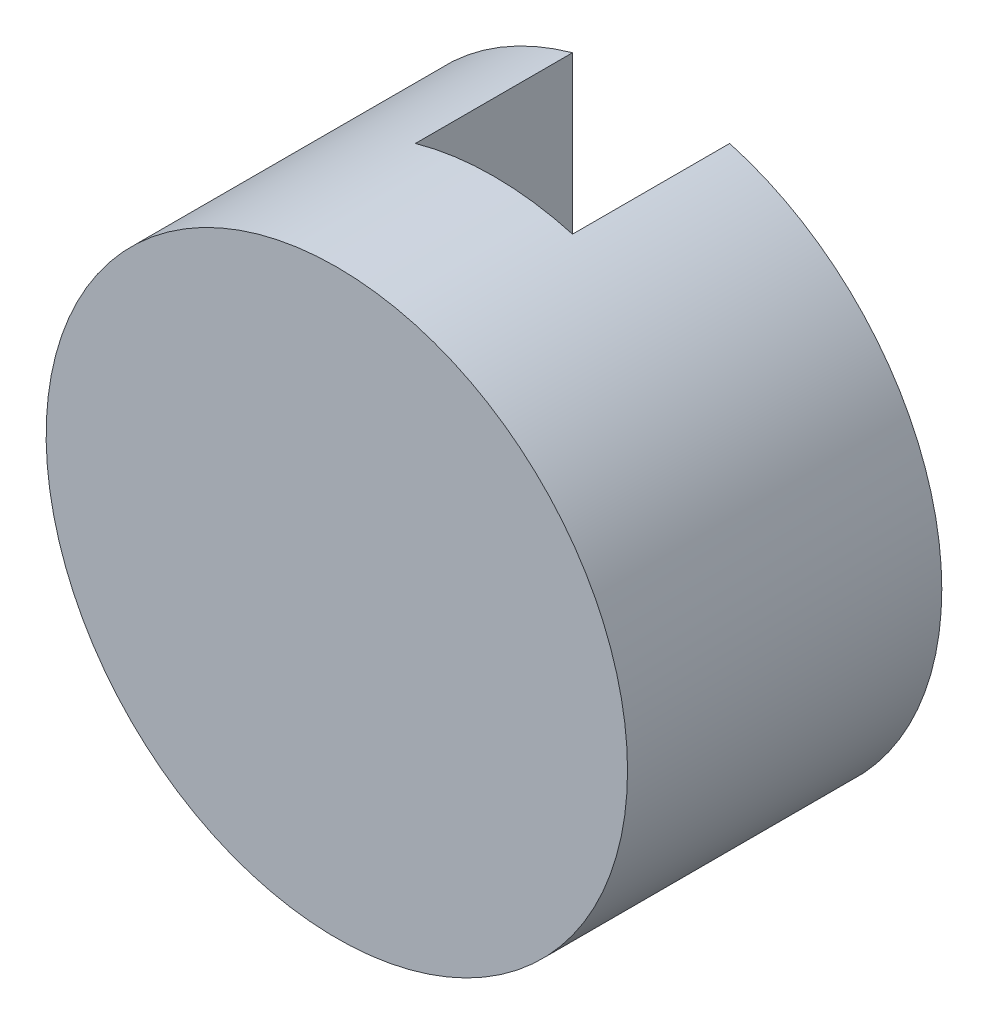
ISO-10303-21;
HEADER;
FILE_DESCRIPTION(('STEP AP214'),'2;1');
FILE_NAME('part.step','',(''),(''),'','','');
FILE_SCHEMA(('AUTOMOTIVE_DESIGN { 1 0 10303 214 1 1 1 1 }'));
ENDSEC;
DATA;
#1=APPLICATION_CONTEXT('core data for automotive mechanical design processes');
#2=APPLICATION_PROTOCOL_DEFINITION('international standard','automotive_design',2000,#1);
#3=PRODUCT_CONTEXT('',#1,'mechanical');
#4=PRODUCT('Part','Part','',(#3));
#5=PRODUCT_RELATED_PRODUCT_CATEGORY('part','',(#4));
#6=PRODUCT_DEFINITION_FORMATION('','',#4);
#7=PRODUCT_DEFINITION_CONTEXT('part definition',#1,'design');
#8=PRODUCT_DEFINITION('design','',#6,#7);
#9=PRODUCT_DEFINITION_SHAPE('','',#8);
#10=(LENGTH_UNIT() NAMED_UNIT(*) SI_UNIT(.MILLI.,.METRE.));
#11=(NAMED_UNIT(*) PLANE_ANGLE_UNIT() SI_UNIT($,.RADIAN.));
#12=(NAMED_UNIT(*) SI_UNIT($,.STERADIAN.) SOLID_ANGLE_UNIT());
#13=UNCERTAINTY_MEASURE_WITH_UNIT(LENGTH_MEASURE(1.E-05),#10,'distance_accuracy_value','');
#14=(GEOMETRIC_REPRESENTATION_CONTEXT(3) GLOBAL_UNCERTAINTY_ASSIGNED_CONTEXT((#13)) GLOBAL_UNIT_ASSIGNED_CONTEXT((#10,
#11,#12)) REPRESENTATION_CONTEXT('',''));
#15=CARTESIAN_POINT('',(0.,0.,0.));
#16=DIRECTION('',(0.,0.,1.));
#17=DIRECTION('',(1.,0.,0.));
#18=AXIS2_PLACEMENT_3D('',#15,#16,#17);
#19=CARTESIAN_POINT('',(-36.8193486030765,12.6460950764007,0.));
#20=DIRECTION('',(0.,0.,1.));
#21=DIRECTION('',(1.,0.,0.));
#22=AXIS2_PLACEMENT_3D('',#19,#20,#21);
#23=PLANE('',#22);
#24=CARTESIAN_POINT('',(-36.8193486030765,12.6460950764007,0.));
#25=DIRECTION('',(0.,0.,1.));
#26=DIRECTION('',(1.,0.,0.));
#27=AXIS2_PLACEMENT_3D('',#24,#25,#26);
#28=CIRCLE('',#27,1.85);
#29=CARTESIAN_POINT('',(-37.3193486030765,14.4272463894564,0.));
#30=VERTEX_POINT('',#29);
#31=CARTESIAN_POINT('',(-37.3193486030765,10.864943763345,0.));
#32=VERTEX_POINT('',#31);
#33=EDGE_CURVE('E93',#30,#32,#28,.T.);
#34=ORIENTED_EDGE('',*,*,#33,.F.);
#35=DIRECTION('',(0.,-1.,0.));
#36=VECTOR('',#35,1.);
#37=CARTESIAN_POINT('',(-37.3193486030765,12.6460950764007,0.));
#38=LINE('',#37,#36);
#39=EDGE_CURVE('E82',#30,#32,#38,.T.);
#40=ORIENTED_EDGE('',*,*,#39,.T.);
#41=EDGE_LOOP('',(#34,#40));
#42=FACE_BOUND('',#41,.T.);
#43=ADVANCED_FACE('F34',(#42),#23,.F.);
#44=CARTESIAN_POINT('',(-36.8193486030765,12.6460950764007,2.));
#45=DIRECTION('',(0.,0.,-1.));
#46=DIRECTION('',(-1.,0.,0.));
#47=AXIS2_PLACEMENT_3D('',#44,#45,#46);
#48=CYLINDRICAL_SURFACE('',#47,1.85);
#49=CARTESIAN_POINT('',(-36.8193486030765,12.6460950764007,1.));
#50=DIRECTION('',(0.,0.,1.));
#51=DIRECTION('',(1.,0.,0.));
#52=AXIS2_PLACEMENT_3D('',#49,#50,#51);
#53=CIRCLE('',#52,1.85);
#54=CARTESIAN_POINT('',(-36.3193486030765,14.4272463894564,1.));
#55=VERTEX_POINT('',#54);
#56=CARTESIAN_POINT('',(-37.3193486030765,14.4272463894564,1.));
#57=VERTEX_POINT('',#56);
#58=EDGE_CURVE('E11',#55,#57,#53,.T.);
#59=ORIENTED_EDGE('',*,*,#58,.T.);
#60=DIRECTION('',(0.,0.,-1.));
#61=VECTOR('',#60,1.);
#62=CARTESIAN_POINT('',(-37.3193486030765,14.4272463894564,2.));
#63=LINE('',#62,#61);
#64=EDGE_CURVE('E57',#57,#30,#63,.T.);
#65=ORIENTED_EDGE('',*,*,#64,.T.);
#66=ORIENTED_EDGE('',*,*,#33,.T.);
#67=DIRECTION('',(0.,0.,-1.));
#68=VECTOR('',#67,1.);
#69=CARTESIAN_POINT('',(-37.3193486030765,10.864943763345,2.));
#70=LINE('',#69,#68);
#71=CARTESIAN_POINT('',(-37.3193486030765,10.864943763345,1.));
#72=VERTEX_POINT('',#71);
#73=EDGE_CURVE('E90',#32,#72,#70,.F.);
#74=ORIENTED_EDGE('',*,*,#73,.T.);
#75=CARTESIAN_POINT('',(-36.3193486030765,10.864943763345,1.));
#76=VERTEX_POINT('',#75);
#77=EDGE_CURVE('E38',#72,#76,#53,.T.);
#78=ORIENTED_EDGE('',*,*,#77,.T.);
#79=DIRECTION('',(0.,0.,-1.));
#80=VECTOR('',#79,1.);
#81=CARTESIAN_POINT('',(-36.3193486030765,10.864943763345,2.));
#82=LINE('',#81,#80);
#83=CARTESIAN_POINT('',(-36.3193486030765,10.864943763345,0.));
#84=VERTEX_POINT('',#83);
#85=EDGE_CURVE('E77',#76,#84,#82,.T.);
#86=ORIENTED_EDGE('',*,*,#85,.T.);
#87=CARTESIAN_POINT('',(-36.3193486030765,14.4272463894564,0.));
#88=VERTEX_POINT('',#87);
#89=EDGE_CURVE('E88',#84,#88,#28,.T.);
#90=ORIENTED_EDGE('',*,*,#89,.T.);
#91=DIRECTION('',(0.,0.,-1.));
#92=VECTOR('',#91,1.);
#93=CARTESIAN_POINT('',(-36.3193486030765,14.4272463894564,2.));
#94=LINE('',#93,#92);
#95=EDGE_CURVE('E49',#88,#55,#94,.F.);
#96=ORIENTED_EDGE('',*,*,#95,.T.);
#97=EDGE_LOOP('',(#59,#65,#66,#74,#78,#86,#90,#96));
#98=FACE_BOUND('',#97,.T.);
#99=CARTESIAN_POINT('',(-36.8193486030765,12.6460950764007,2.));
#100=DIRECTION('',(0.,0.,1.));
#101=DIRECTION('',(1.,0.,0.));
#102=AXIS2_PLACEMENT_3D('',#99,#100,#101);
#103=CIRCLE('',#102,1.85);
#104=CARTESIAN_POINT('',(-34.9693486030765,12.6460950764007,2.));
#105=VERTEX_POINT('',#104);
#106=EDGE_CURVE('E83',#105,#105,#103,.T.);
#107=ORIENTED_EDGE('',*,*,#106,.F.);
#108=EDGE_LOOP('',(#107));
#109=FACE_BOUND('',#108,.T.);
#110=ADVANCED_FACE('F36',(#98,#109),#48,.T.);
#111=CARTESIAN_POINT('',(-36.8193486030765,12.6460950764007,2.));
#112=DIRECTION('',(0.,0.,1.));
#113=DIRECTION('',(1.,0.,0.));
#114=AXIS2_PLACEMENT_3D('',#111,#112,#113);
#115=PLANE('',#114);
#116=ORIENTED_EDGE('',*,*,#106,.T.);
#117=EDGE_LOOP('',(#116));
#118=FACE_BOUND('',#117,.T.);
#119=ADVANCED_FACE('F123',(#118),#115,.T.);
#120=ORIENTED_EDGE('',*,*,#89,.F.);
#121=DIRECTION('',(0.,1.,0.));
#122=VECTOR('',#121,1.);
#123=CARTESIAN_POINT('',(-36.3193486030765,12.6460950764007,0.));
#124=LINE('',#123,#122);
#125=EDGE_CURVE('E74',#84,#88,#124,.T.);
#126=ORIENTED_EDGE('',*,*,#125,.T.);
#127=EDGE_LOOP('',(#120,#126));
#128=FACE_BOUND('',#127,.T.);
#129=ADVANCED_FACE('F92',(#128),#23,.F.);
#130=CARTESIAN_POINT('',(0.,0.,1.));
#131=DIRECTION('',(0.,0.,1.));
#132=DIRECTION('',(1.,0.,0.));
#133=AXIS2_PLACEMENT_3D('',#130,#131,#132);
#134=PLANE('',#133);
#135=DIRECTION('',(0.,-1.,0.));
#136=VECTOR('',#135,1.);
#137=CARTESIAN_POINT('',(-36.3193486030765,15.2637818292334,1.));
#138=LINE('',#137,#136);
#139=EDGE_CURVE('E103',#55,#76,#138,.T.);
#140=ORIENTED_EDGE('',*,*,#139,.T.);
#141=ORIENTED_EDGE('',*,*,#77,.F.);
#142=DIRECTION('',(0.,1.,0.));
#143=VECTOR('',#142,1.);
#144=CARTESIAN_POINT('',(-37.3193486030765,15.2637818292334,1.));
#145=LINE('',#144,#143);
#146=EDGE_CURVE('E104',#72,#57,#145,.T.);
#147=ORIENTED_EDGE('',*,*,#146,.T.);
#148=ORIENTED_EDGE('',*,*,#58,.F.);
#149=EDGE_LOOP('',(#140,#141,#147,#148));
#150=FACE_BOUND('',#149,.T.);
#151=ADVANCED_FACE('F102',(#150),#134,.F.);
#152=CARTESIAN_POINT('',(-37.3193486030765,15.2637818292334,1.));
#153=DIRECTION('',(-1.,0.,0.));
#154=DIRECTION('',(0.,0.,1.));
#155=AXIS2_PLACEMENT_3D('',#152,#153,#154);
#156=PLANE('',#155);
#157=ORIENTED_EDGE('',*,*,#146,.F.);
#158=ORIENTED_EDGE('',*,*,#73,.F.);
#159=ORIENTED_EDGE('',*,*,#39,.F.);
#160=ORIENTED_EDGE('',*,*,#64,.F.);
#161=EDGE_LOOP('',(#157,#158,#159,#160));
#162=FACE_BOUND('',#161,.T.);
#163=ADVANCED_FACE('F109',(#162),#156,.F.);
#164=CARTESIAN_POINT('',(-36.3193486030765,15.2637818292334,1.));
#165=DIRECTION('',(1.,0.,0.));
#166=DIRECTION('',(0.,1.,0.));
#167=AXIS2_PLACEMENT_3D('',#164,#165,#166);
#168=PLANE('',#167);
#169=ORIENTED_EDGE('',*,*,#139,.F.);
#170=ORIENTED_EDGE('',*,*,#95,.F.);
#171=ORIENTED_EDGE('',*,*,#125,.F.);
#172=ORIENTED_EDGE('',*,*,#85,.F.);
#173=EDGE_LOOP('',(#169,#170,#171,#172));
#174=FACE_BOUND('',#173,.T.);
#175=ADVANCED_FACE('F76',(#174),#168,.F.);
#176=CLOSED_SHELL('',(#43,#110,#119,#129,#151,#163,#175));
#177=MANIFOLD_SOLID_BREP('B2',#176);
#178=ADVANCED_BREP_SHAPE_REPRESENTATION('',(#18,#177),#14);
#179=SHAPE_DEFINITION_REPRESENTATION(#9,#178);
ENDSEC;
END-ISO-10303-21;
